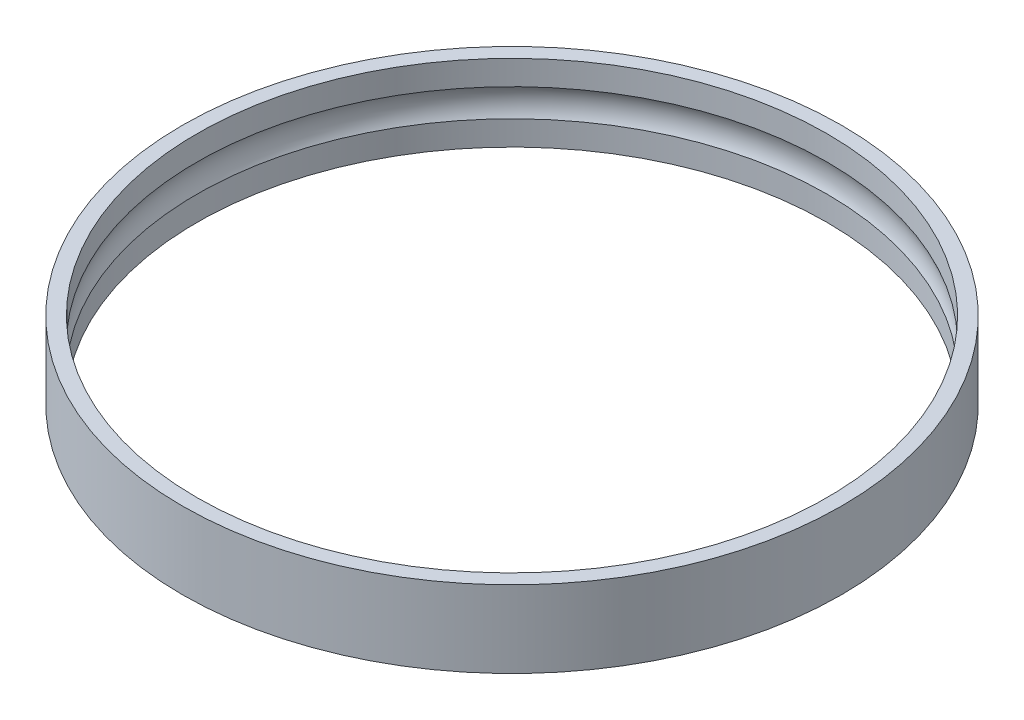
ISO-10303-21;
HEADER;
FILE_DESCRIPTION(('STEP AP214'),'2;1');
FILE_NAME('part.step','',(''),(''),'','','');
FILE_SCHEMA(('AUTOMOTIVE_DESIGN { 1 0 10303 214 1 1 1 1 }'));
ENDSEC;
DATA;
#1=APPLICATION_CONTEXT('core data for automotive mechanical design processes');
#2=APPLICATION_PROTOCOL_DEFINITION('international standard','automotive_design',2000,#1);
#3=PRODUCT_CONTEXT('',#1,'mechanical');
#4=PRODUCT('Part','Part','',(#3));
#5=PRODUCT_RELATED_PRODUCT_CATEGORY('part','',(#4));
#6=PRODUCT_DEFINITION_FORMATION('','',#4);
#7=PRODUCT_DEFINITION_CONTEXT('part definition',#1,'design');
#8=PRODUCT_DEFINITION('design','',#6,#7);
#9=PRODUCT_DEFINITION_SHAPE('','',#8);
#10=(LENGTH_UNIT() NAMED_UNIT(*) SI_UNIT(.MILLI.,.METRE.));
#11=(NAMED_UNIT(*) PLANE_ANGLE_UNIT() SI_UNIT($,.RADIAN.));
#12=(NAMED_UNIT(*) SI_UNIT($,.STERADIAN.) SOLID_ANGLE_UNIT());
#13=UNCERTAINTY_MEASURE_WITH_UNIT(LENGTH_MEASURE(1.E-05),#10,'distance_accuracy_value','');
#14=(GEOMETRIC_REPRESENTATION_CONTEXT(3) GLOBAL_UNCERTAINTY_ASSIGNED_CONTEXT((#13)) GLOBAL_UNIT_ASSIGNED_CONTEXT((#10,
#11,#12)) REPRESENTATION_CONTEXT('',''));
#15=CARTESIAN_POINT('',(0.,0.,0.));
#16=DIRECTION('',(0.,0.,1.));
#17=DIRECTION('',(1.,0.,0.));
#18=AXIS2_PLACEMENT_3D('',#15,#16,#17);
#19=CARTESIAN_POINT('',(0.,0.,0.));
#20=DIRECTION('',(0.,-1.,0.));
#21=DIRECTION('',(0.,0.,-1.));
#22=AXIS2_PLACEMENT_3D('',#19,#20,#21);
#23=CYLINDRICAL_SURFACE('',#22,16.948);
#24=CARTESIAN_POINT('',(0.,-5.15,0.));
#25=DIRECTION('',(0.,-1.,0.));
#26=DIRECTION('',(0.,0.,-1.));
#27=AXIS2_PLACEMENT_3D('',#24,#25,#26);
#28=CIRCLE('',#27,16.948);
#29=CARTESIAN_POINT('',(0.,-5.15,-16.948));
#30=VERTEX_POINT('',#29);
#31=EDGE_CURVE('E28',#30,#30,#28,.T.);
#32=ORIENTED_EDGE('',*,*,#31,.F.);
#33=EDGE_LOOP('',(#32));
#34=FACE_BOUND('',#33,.T.);
#35=CARTESIAN_POINT('',(0.,-1.2,0.));
#36=DIRECTION('',(0.,-1.,0.));
#37=DIRECTION('',(0.,0.,-1.));
#38=AXIS2_PLACEMENT_3D('',#35,#36,#37);
#39=CIRCLE('',#38,16.948);
#40=CARTESIAN_POINT('',(0.,-1.2,-16.948));
#41=VERTEX_POINT('',#40);
#42=EDGE_CURVE('E11',#41,#41,#39,.T.);
#43=ORIENTED_EDGE('',*,*,#42,.T.);
#44=EDGE_LOOP('',(#43));
#45=FACE_BOUND('',#44,.T.);
#46=ADVANCED_FACE('F17',(#34,#45),#23,.T.);
#47=CARTESIAN_POINT('',(16.948,-5.15,0.));
#48=DIRECTION('',(0.,1.,0.));
#49=DIRECTION('',(0.,0.,1.));
#50=AXIS2_PLACEMENT_3D('',#47,#48,#49);
#51=PLANE('',#50);
#52=CARTESIAN_POINT('',(0.,-5.15,0.));
#53=DIRECTION('',(0.,-1.,0.));
#54=DIRECTION('',(0.,0.,-1.));
#55=AXIS2_PLACEMENT_3D('',#52,#53,#54);
#56=CIRCLE('',#55,16.198);
#57=CARTESIAN_POINT('',(0.,-5.15,-16.198));
#58=VERTEX_POINT('',#57);
#59=EDGE_CURVE('E63',#58,#58,#56,.T.);
#60=ORIENTED_EDGE('',*,*,#59,.F.);
#61=EDGE_LOOP('',(#60));
#62=FACE_BOUND('',#61,.T.);
#63=ORIENTED_EDGE('',*,*,#31,.T.);
#64=EDGE_LOOP('',(#63));
#65=FACE_BOUND('',#64,.T.);
#66=ADVANCED_FACE('F72',(#62,#65),#51,.F.);
#67=CARTESIAN_POINT('',(0.,0.,0.));
#68=DIRECTION('',(0.,-1.,0.));
#69=DIRECTION('',(0.,0.,-1.));
#70=AXIS2_PLACEMENT_3D('',#67,#68,#69);
#71=CYLINDRICAL_SURFACE('',#70,16.198);
#72=CARTESIAN_POINT('',(0.,-3.88970815722223,0.));
#73=DIRECTION('',(0.,-1.,0.));
#74=DIRECTION('',(0.,0.,-1.));
#75=AXIS2_PLACEMENT_3D('',#72,#73,#74);
#76=CIRCLE('',#75,16.198);
#77=CARTESIAN_POINT('',(0.,-3.88970815722223,-16.198));
#78=VERTEX_POINT('',#77);
#79=EDGE_CURVE('E59',#78,#78,#76,.T.);
#80=ORIENTED_EDGE('',*,*,#79,.F.);
#81=EDGE_LOOP('',(#80));
#82=FACE_BOUND('',#81,.T.);
#83=ORIENTED_EDGE('',*,*,#59,.T.);
#84=EDGE_LOOP('',(#83));
#85=FACE_BOUND('',#84,.T.);
#86=ADVANCED_FACE('F74',(#82,#85),#71,.F.);
#87=CARTESIAN_POINT('',(0.,-3.175,0.));
#88=DIRECTION('',(0.,-1.,0.));
#89=DIRECTION('',(0.,0.,-1.));
#90=AXIS2_PLACEMENT_3D('',#87,#88,#89);
#91=TOROIDAL_SURFACE('',#90,14.7665,1.6);
#92=CARTESIAN_POINT('',(0.,-2.4602918427774,0.));
#93=DIRECTION('',(0.,-1.,0.));
#94=DIRECTION('',(0.,0.,-1.));
#95=AXIS2_PLACEMENT_3D('',#92,#93,#94);
#96=CIRCLE('',#95,16.198);
#97=CARTESIAN_POINT('',(0.,-2.4602918427774,-16.198));
#98=VERTEX_POINT('',#97);
#99=EDGE_CURVE('E47',#98,#98,#96,.T.);
#100=ORIENTED_EDGE('',*,*,#99,.F.);
#101=EDGE_LOOP('',(#100));
#102=FACE_BOUND('',#101,.T.);
#103=ORIENTED_EDGE('',*,*,#79,.T.);
#104=EDGE_LOOP('',(#103));
#105=FACE_BOUND('',#104,.T.);
#106=ADVANCED_FACE('F82',(#102,#105),#91,.F.);
#107=CARTESIAN_POINT('',(0.,0.,0.));
#108=DIRECTION('',(0.,-1.,0.));
#109=DIRECTION('',(0.,0.,-1.));
#110=AXIS2_PLACEMENT_3D('',#107,#108,#109);
#111=CYLINDRICAL_SURFACE('',#110,16.198);
#112=CARTESIAN_POINT('',(0.,-1.2,0.));
#113=DIRECTION('',(0.,-1.,0.));
#114=DIRECTION('',(0.,0.,-1.));
#115=AXIS2_PLACEMENT_3D('',#112,#113,#114);
#116=CIRCLE('',#115,16.198);
#117=CARTESIAN_POINT('',(0.,-1.2,-16.198));
#118=VERTEX_POINT('',#117);
#119=EDGE_CURVE('E21',#118,#118,#116,.T.);
#120=ORIENTED_EDGE('',*,*,#119,.F.);
#121=EDGE_LOOP('',(#120));
#122=FACE_BOUND('',#121,.T.);
#123=ORIENTED_EDGE('',*,*,#99,.T.);
#124=EDGE_LOOP('',(#123));
#125=FACE_BOUND('',#124,.T.);
#126=ADVANCED_FACE('F51',(#122,#125),#111,.F.);
#127=CARTESIAN_POINT('',(16.198,-1.2,0.));
#128=DIRECTION('',(0.,-1.,0.));
#129=DIRECTION('',(0.,0.,-1.));
#130=AXIS2_PLACEMENT_3D('',#127,#128,#129);
#131=PLANE('',#130);
#132=ORIENTED_EDGE('',*,*,#42,.F.);
#133=EDGE_LOOP('',(#132));
#134=FACE_BOUND('',#133,.T.);
#135=ORIENTED_EDGE('',*,*,#119,.T.);
#136=EDGE_LOOP('',(#135));
#137=FACE_BOUND('',#136,.T.);
#138=ADVANCED_FACE('F19',(#134,#137),#131,.F.);
#139=CLOSED_SHELL('',(#46,#66,#86,#106,#126,#138));
#140=MANIFOLD_SOLID_BREP('B1',#139);
#141=ADVANCED_BREP_SHAPE_REPRESENTATION('',(#18,#140),#14);
#142=SHAPE_DEFINITION_REPRESENTATION(#9,#141);
ENDSEC;
END-ISO-10303-21;
